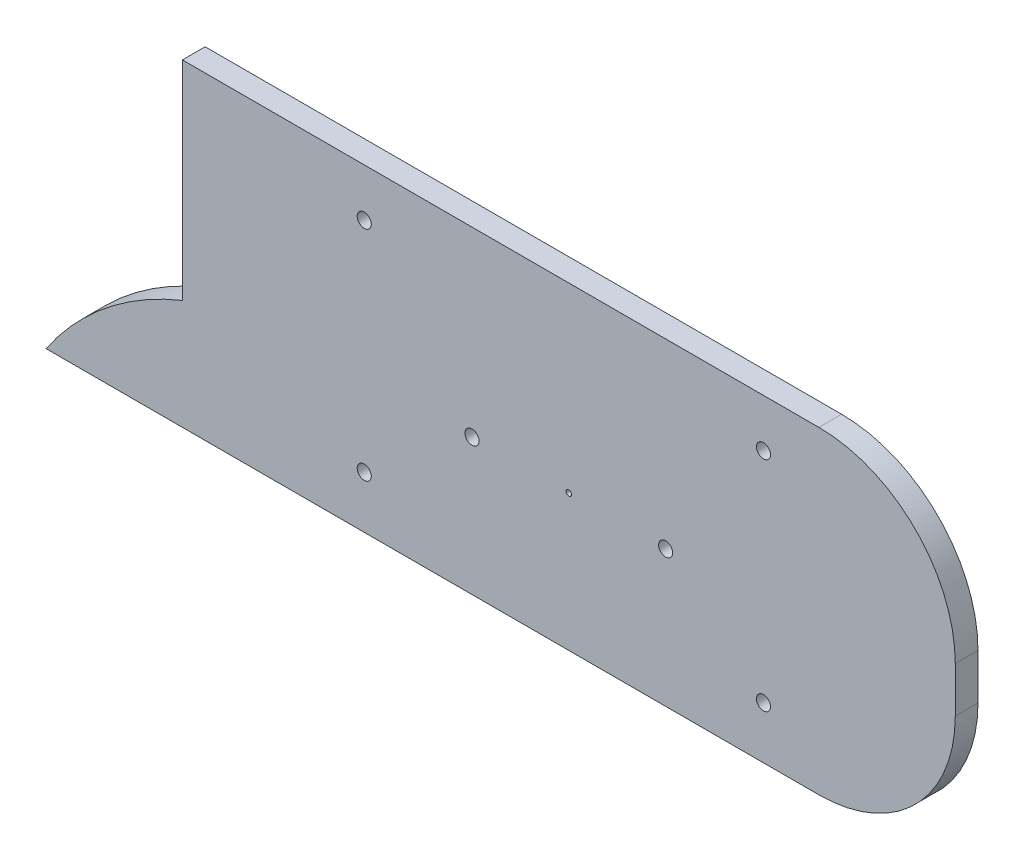
ISO-10303-21;
HEADER;
FILE_DESCRIPTION(('STEP AP214'),'2;1');
FILE_NAME('part.step','',(''),(''),'','','');
FILE_SCHEMA(('AUTOMOTIVE_DESIGN { 1 0 10303 214 1 1 1 1 }'));
ENDSEC;
DATA;
#1=APPLICATION_CONTEXT('core data for automotive mechanical design processes');
#2=APPLICATION_PROTOCOL_DEFINITION('international standard','automotive_design',2000,#1);
#3=PRODUCT_CONTEXT('',#1,'mechanical');
#4=PRODUCT('Part','Part','',(#3));
#5=PRODUCT_RELATED_PRODUCT_CATEGORY('part','',(#4));
#6=PRODUCT_DEFINITION_FORMATION('','',#4);
#7=PRODUCT_DEFINITION_CONTEXT('part definition',#1,'design');
#8=PRODUCT_DEFINITION('design','',#6,#7);
#9=PRODUCT_DEFINITION_SHAPE('','',#8);
#10=(LENGTH_UNIT() NAMED_UNIT(*) SI_UNIT(.MILLI.,.METRE.));
#11=(NAMED_UNIT(*) PLANE_ANGLE_UNIT() SI_UNIT($,.RADIAN.));
#12=(NAMED_UNIT(*) SI_UNIT($,.STERADIAN.) SOLID_ANGLE_UNIT());
#13=UNCERTAINTY_MEASURE_WITH_UNIT(LENGTH_MEASURE(1.E-05),#10,'distance_accuracy_value','');
#14=(GEOMETRIC_REPRESENTATION_CONTEXT(3) GLOBAL_UNCERTAINTY_ASSIGNED_CONTEXT((#13)) GLOBAL_UNIT_ASSIGNED_CONTEXT((#10,
#11,#12)) REPRESENTATION_CONTEXT('',''));
#15=CARTESIAN_POINT('',(0.,0.,0.));
#16=DIRECTION('',(0.,0.,1.));
#17=DIRECTION('',(1.,0.,0.));
#18=AXIS2_PLACEMENT_3D('',#15,#16,#17);
#19=CARTESIAN_POINT('',(138.386915245051,-93.7571467165055,12.7));
#20=DIRECTION('',(0.,0.,-1.));
#21=DIRECTION('',(-1.,0.,0.));
#22=AXIS2_PLACEMENT_3D('',#19,#20,#21);
#23=CYLINDRICAL_SURFACE('',#22,167.156635738642);
#24=CARTESIAN_POINT('',(138.386915245051,-93.7571467165055,0.));
#25=DIRECTION('',(0.,0.,1.));
#26=DIRECTION('',(-1.,0.,0.));
#27=AXIS2_PLACEMENT_3D('',#24,#25,#26);
#28=CIRCLE('',#27,167.156635738642);
#29=CARTESIAN_POINT('',(76.2,61.4012511991924,0.));
#30=VERTEX_POINT('',#29);
#31=CARTESIAN_POINT('',(0.,0.,0.));
#32=VERTEX_POINT('',#31);
#33=EDGE_CURVE('E143',#30,#32,#28,.T.);
#34=ORIENTED_EDGE('',*,*,#33,.T.);
#35=DIRECTION('',(0.,0.,-1.));
#36=VECTOR('',#35,1.);
#37=CARTESIAN_POINT('',(0.,0.,12.7));
#38=LINE('',#37,#36);
#39=CARTESIAN_POINT('',(0.,0.,12.7));
#40=VERTEX_POINT('',#39);
#41=EDGE_CURVE('E11',#40,#32,#38,.T.);
#42=ORIENTED_EDGE('',*,*,#41,.F.);
#43=CARTESIAN_POINT('',(138.386915245051,-93.7571467165055,12.7));
#44=DIRECTION('',(0.,0.,1.));
#45=DIRECTION('',(-1.,0.,0.));
#46=AXIS2_PLACEMENT_3D('',#43,#44,#45);
#47=CIRCLE('',#46,167.156635738642);
#48=CARTESIAN_POINT('',(76.2,61.4012511991924,12.7));
#49=VERTEX_POINT('',#48);
#50=EDGE_CURVE('E163',#49,#40,#47,.T.);
#51=ORIENTED_EDGE('',*,*,#50,.F.);
#52=DIRECTION('',(0.,0.,-1.));
#53=VECTOR('',#52,1.);
#54=CARTESIAN_POINT('',(76.2,61.4012511991924,12.7));
#55=LINE('',#54,#53);
#56=EDGE_CURVE('E139',#49,#30,#55,.T.);
#57=ORIENTED_EDGE('',*,*,#56,.T.);
#58=EDGE_LOOP('',(#34,#42,#51,#57));
#59=FACE_BOUND('',#58,.T.);
#60=ADVANCED_FACE('F47',(#59),#23,.T.);
#61=CARTESIAN_POINT('',(0.,0.,12.7));
#62=DIRECTION('',(0.,1.,0.));
#63=DIRECTION('',(-1.,0.,0.));
#64=AXIS2_PLACEMENT_3D('',#61,#62,#63);
#65=PLANE('',#64);
#66=DIRECTION('',(1.,0.,0.));
#67=VECTOR('',#66,1.);
#68=CARTESIAN_POINT('',(0.,0.,0.));
#69=LINE('',#68,#67);
#70=CARTESIAN_POINT('',(431.8,0.,0.));
#71=VERTEX_POINT('',#70);
#72=EDGE_CURVE('E147',#32,#71,#69,.T.);
#73=ORIENTED_EDGE('',*,*,#72,.T.);
#74=DIRECTION('',(0.,0.,-1.));
#75=VECTOR('',#74,1.);
#76=CARTESIAN_POINT('',(431.8,0.,12.7));
#77=LINE('',#76,#75);
#78=CARTESIAN_POINT('',(431.8,0.,12.7));
#79=VERTEX_POINT('',#78);
#80=EDGE_CURVE('E56',#79,#71,#77,.T.);
#81=ORIENTED_EDGE('',*,*,#80,.F.);
#82=DIRECTION('',(1.,0.,0.));
#83=VECTOR('',#82,1.);
#84=CARTESIAN_POINT('',(0.,0.,12.7));
#85=LINE('',#84,#83);
#86=EDGE_CURVE('E103',#40,#79,#85,.T.);
#87=ORIENTED_EDGE('',*,*,#86,.F.);
#88=ORIENTED_EDGE('',*,*,#41,.T.);
#89=EDGE_LOOP('',(#73,#81,#87,#88));
#90=FACE_BOUND('',#89,.T.);
#91=ADVANCED_FACE('F287',(#90),#65,.F.);
#92=CARTESIAN_POINT('',(431.8,76.2,12.7));
#93=DIRECTION('',(0.,0.,-1.));
#94=DIRECTION('',(-1.,0.,0.));
#95=AXIS2_PLACEMENT_3D('',#92,#93,#94);
#96=CYLINDRICAL_SURFACE('',#95,76.2);
#97=CARTESIAN_POINT('',(431.8,76.2,0.));
#98=DIRECTION('',(0.,0.,1.));
#99=DIRECTION('',(1.,0.,0.));
#100=AXIS2_PLACEMENT_3D('',#97,#98,#99);
#101=CIRCLE('',#100,76.2);
#102=CARTESIAN_POINT('',(508.,76.2,0.));
#103=VERTEX_POINT('',#102);
#104=EDGE_CURVE('E151',#71,#103,#101,.T.);
#105=ORIENTED_EDGE('',*,*,#104,.T.);
#106=DIRECTION('',(0.,0.,-1.));
#107=VECTOR('',#106,1.);
#108=CARTESIAN_POINT('',(508.,76.2,12.7));
#109=LINE('',#108,#107);
#110=CARTESIAN_POINT('',(508.,76.2,12.7));
#111=VERTEX_POINT('',#110);
#112=EDGE_CURVE('E170',#111,#103,#109,.T.);
#113=ORIENTED_EDGE('',*,*,#112,.F.);
#114=CARTESIAN_POINT('',(431.8,76.2,12.7));
#115=DIRECTION('',(0.,0.,1.));
#116=DIRECTION('',(1.,0.,0.));
#117=AXIS2_PLACEMENT_3D('',#114,#115,#116);
#118=CIRCLE('',#117,76.2);
#119=EDGE_CURVE('E181',#79,#111,#118,.T.);
#120=ORIENTED_EDGE('',*,*,#119,.F.);
#121=ORIENTED_EDGE('',*,*,#80,.T.);
#122=EDGE_LOOP('',(#105,#113,#120,#121));
#123=FACE_BOUND('',#122,.T.);
#124=ADVANCED_FACE('F179',(#123),#96,.T.);
#125=CARTESIAN_POINT('',(508.,76.2,12.7));
#126=DIRECTION('',(-1.,0.,0.));
#127=DIRECTION('',(0.,0.,1.));
#128=AXIS2_PLACEMENT_3D('',#125,#126,#127);
#129=PLANE('',#128);
#130=DIRECTION('',(0.,1.,0.));
#131=VECTOR('',#130,1.);
#132=CARTESIAN_POINT('',(508.,76.2,0.));
#133=LINE('',#132,#131);
#134=CARTESIAN_POINT('',(508.,101.6,0.));
#135=VERTEX_POINT('',#134);
#136=EDGE_CURVE('E154',#103,#135,#133,.T.);
#137=ORIENTED_EDGE('',*,*,#136,.T.);
#138=DIRECTION('',(0.,0.,-1.));
#139=VECTOR('',#138,1.);
#140=CARTESIAN_POINT('',(508.,101.6,12.7));
#141=LINE('',#140,#139);
#142=CARTESIAN_POINT('',(508.,101.6,12.7));
#143=VERTEX_POINT('',#142);
#144=EDGE_CURVE('E131',#143,#135,#141,.T.);
#145=ORIENTED_EDGE('',*,*,#144,.F.);
#146=DIRECTION('',(0.,1.,0.));
#147=VECTOR('',#146,1.);
#148=CARTESIAN_POINT('',(508.,76.2,12.7));
#149=LINE('',#148,#147);
#150=EDGE_CURVE('E119',#111,#143,#149,.T.);
#151=ORIENTED_EDGE('',*,*,#150,.F.);
#152=ORIENTED_EDGE('',*,*,#112,.T.);
#153=EDGE_LOOP('',(#137,#145,#151,#152));
#154=FACE_BOUND('',#153,.T.);
#155=ADVANCED_FACE('F187',(#154),#129,.F.);
#156=CARTESIAN_POINT('',(431.8,101.6,12.7));
#157=DIRECTION('',(0.,0.,-1.));
#158=DIRECTION('',(-1.,0.,0.));
#159=AXIS2_PLACEMENT_3D('',#156,#157,#158);
#160=CYLINDRICAL_SURFACE('',#159,76.2);
#161=CARTESIAN_POINT('',(431.8,101.6,0.));
#162=DIRECTION('',(0.,0.,1.));
#163=DIRECTION('',(1.,0.,0.));
#164=AXIS2_PLACEMENT_3D('',#161,#162,#163);
#165=CIRCLE('',#164,76.2);
#166=CARTESIAN_POINT('',(431.8,177.8,0.));
#167=VERTEX_POINT('',#166);
#168=EDGE_CURVE('E129',#135,#167,#165,.T.);
#169=ORIENTED_EDGE('',*,*,#168,.T.);
#170=DIRECTION('',(0.,0.,-1.));
#171=VECTOR('',#170,1.);
#172=CARTESIAN_POINT('',(431.8,177.8,12.7));
#173=LINE('',#172,#171);
#174=CARTESIAN_POINT('',(431.8,177.8,12.7));
#175=VERTEX_POINT('',#174);
#176=EDGE_CURVE('E126',#175,#167,#173,.T.);
#177=ORIENTED_EDGE('',*,*,#176,.F.);
#178=CARTESIAN_POINT('',(431.8,101.6,12.7));
#179=DIRECTION('',(0.,0.,1.));
#180=DIRECTION('',(1.,0.,0.));
#181=AXIS2_PLACEMENT_3D('',#178,#179,#180);
#182=CIRCLE('',#181,76.2);
#183=EDGE_CURVE('E113',#143,#175,#182,.T.);
#184=ORIENTED_EDGE('',*,*,#183,.F.);
#185=ORIENTED_EDGE('',*,*,#144,.T.);
#186=EDGE_LOOP('',(#169,#177,#184,#185));
#187=FACE_BOUND('',#186,.T.);
#188=ADVANCED_FACE('F127',(#187),#160,.T.);
#189=CARTESIAN_POINT('',(152.4,177.8,12.7));
#190=DIRECTION('',(0.,-1.,0.));
#191=DIRECTION('',(0.,0.,-1.));
#192=AXIS2_PLACEMENT_3D('',#189,#190,#191);
#193=PLANE('',#192);
#194=DIRECTION('',(-1.,0.,0.));
#195=VECTOR('',#194,1.);
#196=CARTESIAN_POINT('',(152.4,177.8,0.));
#197=LINE('',#196,#195);
#198=CARTESIAN_POINT('',(76.2,177.8,0.));
#199=VERTEX_POINT('',#198);
#200=EDGE_CURVE('E89',#167,#199,#197,.T.);
#201=ORIENTED_EDGE('',*,*,#200,.T.);
#202=DIRECTION('',(0.,0.,-1.));
#203=VECTOR('',#202,1.);
#204=CARTESIAN_POINT('',(76.2,177.8,12.7));
#205=LINE('',#204,#203);
#206=CARTESIAN_POINT('',(76.2,177.8,12.7));
#207=VERTEX_POINT('',#206);
#208=EDGE_CURVE('E132',#207,#199,#205,.T.);
#209=ORIENTED_EDGE('',*,*,#208,.F.);
#210=DIRECTION('',(-1.,0.,0.));
#211=VECTOR('',#210,1.);
#212=CARTESIAN_POINT('',(431.8,177.8,12.7));
#213=LINE('',#212,#211);
#214=EDGE_CURVE('E117',#175,#207,#213,.T.);
#215=ORIENTED_EDGE('',*,*,#214,.F.);
#216=ORIENTED_EDGE('',*,*,#176,.T.);
#217=EDGE_LOOP('',(#201,#209,#215,#216));
#218=FACE_BOUND('',#217,.T.);
#219=ADVANCED_FACE('F134',(#218),#193,.F.);
#220=CARTESIAN_POINT('',(76.2,177.8,12.7));
#221=DIRECTION('',(1.,0.,0.));
#222=DIRECTION('',(0.,0.,-1.));
#223=AXIS2_PLACEMENT_3D('',#220,#221,#222);
#224=PLANE('',#223);
#225=DIRECTION('',(0.,-1.,0.));
#226=VECTOR('',#225,1.);
#227=CARTESIAN_POINT('',(76.2,177.8,0.));
#228=LINE('',#227,#226);
#229=EDGE_CURVE('E95',#199,#30,#228,.T.);
#230=ORIENTED_EDGE('',*,*,#229,.T.);
#231=ORIENTED_EDGE('',*,*,#56,.F.);
#232=DIRECTION('',(0.,-1.,0.));
#233=VECTOR('',#232,1.);
#234=CARTESIAN_POINT('',(76.2,177.8,12.7));
#235=LINE('',#234,#233);
#236=EDGE_CURVE('E64',#207,#49,#235,.T.);
#237=ORIENTED_EDGE('',*,*,#236,.F.);
#238=ORIENTED_EDGE('',*,*,#208,.T.);
#239=EDGE_LOOP('',(#230,#231,#237,#238));
#240=FACE_BOUND('',#239,.T.);
#241=ADVANCED_FACE('F258',(#240),#224,.F.);
#242=CARTESIAN_POINT('',(138.386915245051,-93.7571467165055,12.7));
#243=DIRECTION('',(0.,0.,-1.));
#244=DIRECTION('',(-1.,0.,0.));
#245=AXIS2_PLACEMENT_3D('',#242,#243,#244);
#246=PLANE('',#245);
#247=CARTESIAN_POINT('',(346.202,76.2,12.7));
#248=DIRECTION('',(0.,0.,1.));
#249=DIRECTION('',(1.,0.,0.));
#250=AXIS2_PLACEMENT_3D('',#247,#248,#249);
#251=CIRCLE('',#250,3.937);
#252=CARTESIAN_POINT('',(350.139,76.2,12.7));
#253=VERTEX_POINT('',#252);
#254=EDGE_CURVE('E241',#253,#253,#251,.T.);
#255=ORIENTED_EDGE('',*,*,#254,.F.);
#256=EDGE_LOOP('',(#255));
#257=FACE_BOUND('',#256,.T.);
#258=CARTESIAN_POINT('',(237.998,76.2,12.7));
#259=DIRECTION('',(0.,0.,1.));
#260=DIRECTION('',(1.,0.,0.));
#261=AXIS2_PLACEMENT_3D('',#258,#259,#260);
#262=CIRCLE('',#261,3.937);
#263=CARTESIAN_POINT('',(241.935,76.2,12.7));
#264=VERTEX_POINT('',#263);
#265=EDGE_CURVE('E233',#264,#264,#262,.T.);
#266=ORIENTED_EDGE('',*,*,#265,.F.);
#267=EDGE_LOOP('',(#266));
#268=FACE_BOUND('',#267,.T.);
#269=CARTESIAN_POINT('',(292.1,76.2,12.7));
#270=DIRECTION('',(0.,0.,1.));
#271=DIRECTION('',(1.,0.,0.));
#272=AXIS2_PLACEMENT_3D('',#269,#270,#271);
#273=CIRCLE('',#272,1.52400000000001);
#274=CARTESIAN_POINT('',(293.624,76.2,12.7));
#275=VERTEX_POINT('',#274);
#276=EDGE_CURVE('E229',#275,#275,#273,.T.);
#277=ORIENTED_EDGE('',*,*,#276,.F.);
#278=EDGE_LOOP('',(#277));
#279=FACE_BOUND('',#278,.T.);
#280=CARTESIAN_POINT('',(177.8,151.002055279283,12.7));
#281=DIRECTION('',(0.,0.,-1.));
#282=DIRECTION('',(-1.,0.,0.));
#283=AXIS2_PLACEMENT_3D('',#280,#281,#282);
#284=CIRCLE('',#283,3.937);
#285=CARTESIAN_POINT('',(173.863,151.002055279283,12.7));
#286=VERTEX_POINT('',#285);
#287=EDGE_CURVE('E205',#286,#286,#284,.T.);
#288=ORIENTED_EDGE('',*,*,#287,.T.);
#289=EDGE_LOOP('',(#288));
#290=FACE_BOUND('',#289,.T.);
#291=CARTESIAN_POINT('',(400.836394981922,151.002055279283,12.7));
#292=DIRECTION('',(0.,0.,-1.));
#293=DIRECTION('',(-1.,0.,0.));
#294=AXIS2_PLACEMENT_3D('',#291,#292,#293);
#295=CIRCLE('',#294,3.937);
#296=CARTESIAN_POINT('',(396.899394981922,151.002055279283,12.7));
#297=VERTEX_POINT('',#296);
#298=EDGE_CURVE('E214',#297,#297,#295,.T.);
#299=ORIENTED_EDGE('',*,*,#298,.T.);
#300=EDGE_LOOP('',(#299));
#301=FACE_BOUND('',#300,.T.);
#302=CARTESIAN_POINT('',(400.836394981922,29.0820552792826,12.7));
#303=DIRECTION('',(0.,0.,-1.));
#304=DIRECTION('',(-1.,0.,0.));
#305=AXIS2_PLACEMENT_3D('',#302,#303,#304);
#306=CIRCLE('',#305,3.937);
#307=CARTESIAN_POINT('',(396.899394981922,29.0820552792826,12.7));
#308=VERTEX_POINT('',#307);
#309=EDGE_CURVE('E222',#308,#308,#306,.T.);
#310=ORIENTED_EDGE('',*,*,#309,.T.);
#311=EDGE_LOOP('',(#310));
#312=FACE_BOUND('',#311,.T.);
#313=CARTESIAN_POINT('',(177.8,29.0820552792826,12.7));
#314=DIRECTION('',(0.,0.,-1.));
#315=DIRECTION('',(-1.,0.,0.));
#316=AXIS2_PLACEMENT_3D('',#313,#314,#315);
#317=CIRCLE('',#316,3.937);
#318=CARTESIAN_POINT('',(173.863,29.0820552792826,12.7));
#319=VERTEX_POINT('',#318);
#320=EDGE_CURVE('E148',#319,#319,#317,.T.);
#321=ORIENTED_EDGE('',*,*,#320,.T.);
#322=EDGE_LOOP('',(#321));
#323=FACE_BOUND('',#322,.T.);
#324=ORIENTED_EDGE('',*,*,#50,.T.);
#325=ORIENTED_EDGE('',*,*,#86,.T.);
#326=ORIENTED_EDGE('',*,*,#119,.T.);
#327=ORIENTED_EDGE('',*,*,#150,.T.);
#328=ORIENTED_EDGE('',*,*,#183,.T.);
#329=ORIENTED_EDGE('',*,*,#214,.T.);
#330=ORIENTED_EDGE('',*,*,#236,.T.);
#331=EDGE_LOOP('',(#324,#325,#326,#327,#328,#329,#330));
#332=FACE_BOUND('',#331,.T.);
#333=ADVANCED_FACE('F115',(#257,#268,#279,#290,#301,#312,#323,#332),#246,.F.);
#334=CARTESIAN_POINT('',(138.386915245051,-93.7571467165055,0.));
#335=DIRECTION('',(0.,0.,-1.));
#336=DIRECTION('',(-1.,0.,0.));
#337=AXIS2_PLACEMENT_3D('',#334,#335,#336);
#338=PLANE('',#337);
#339=CARTESIAN_POINT('',(346.202,76.2,0.));
#340=DIRECTION('',(0.,0.,1.));
#341=DIRECTION('',(1.,0.,0.));
#342=AXIS2_PLACEMENT_3D('',#339,#340,#341);
#343=CIRCLE('',#342,3.937);
#344=CARTESIAN_POINT('',(350.139,76.2,0.));
#345=VERTEX_POINT('',#344);
#346=EDGE_CURVE('E237',#345,#345,#343,.T.);
#347=ORIENTED_EDGE('',*,*,#346,.T.);
#348=EDGE_LOOP('',(#347));
#349=FACE_BOUND('',#348,.T.);
#350=CARTESIAN_POINT('',(237.998,76.2,0.));
#351=DIRECTION('',(0.,0.,1.));
#352=DIRECTION('',(1.,0.,0.));
#353=AXIS2_PLACEMENT_3D('',#350,#351,#352);
#354=CIRCLE('',#353,3.937);
#355=CARTESIAN_POINT('',(241.935,76.2,0.));
#356=VERTEX_POINT('',#355);
#357=EDGE_CURVE('E245',#356,#356,#354,.T.);
#358=ORIENTED_EDGE('',*,*,#357,.T.);
#359=EDGE_LOOP('',(#358));
#360=FACE_BOUND('',#359,.T.);
#361=CARTESIAN_POINT('',(292.1,76.2,0.));
#362=DIRECTION('',(0.,0.,1.));
#363=DIRECTION('',(1.,0.,0.));
#364=AXIS2_PLACEMENT_3D('',#361,#362,#363);
#365=CIRCLE('',#364,1.52400000000001);
#366=CARTESIAN_POINT('',(293.624,76.2,0.));
#367=VERTEX_POINT('',#366);
#368=EDGE_CURVE('E210',#367,#367,#365,.T.);
#369=ORIENTED_EDGE('',*,*,#368,.T.);
#370=EDGE_LOOP('',(#369));
#371=FACE_BOUND('',#370,.T.);
#372=CARTESIAN_POINT('',(177.8,151.002055279283,0.));
#373=DIRECTION('',(0.,0.,-1.));
#374=DIRECTION('',(-1.,0.,0.));
#375=AXIS2_PLACEMENT_3D('',#372,#373,#374);
#376=CIRCLE('',#375,3.937);
#377=CARTESIAN_POINT('',(173.863,151.002055279283,0.));
#378=VERTEX_POINT('',#377);
#379=EDGE_CURVE('E209',#378,#378,#376,.T.);
#380=ORIENTED_EDGE('',*,*,#379,.F.);
#381=EDGE_LOOP('',(#380));
#382=FACE_BOUND('',#381,.T.);
#383=CARTESIAN_POINT('',(400.836394981922,151.002055279283,0.));
#384=DIRECTION('',(0.,0.,-1.));
#385=DIRECTION('',(-1.,0.,0.));
#386=AXIS2_PLACEMENT_3D('',#383,#384,#385);
#387=CIRCLE('',#386,3.937);
#388=CARTESIAN_POINT('',(396.899394981922,151.002055279283,0.));
#389=VERTEX_POINT('',#388);
#390=EDGE_CURVE('E218',#389,#389,#387,.T.);
#391=ORIENTED_EDGE('',*,*,#390,.F.);
#392=EDGE_LOOP('',(#391));
#393=FACE_BOUND('',#392,.T.);
#394=CARTESIAN_POINT('',(400.836394981922,29.0820552792826,0.));
#395=DIRECTION('',(0.,0.,-1.));
#396=DIRECTION('',(-1.,0.,0.));
#397=AXIS2_PLACEMENT_3D('',#394,#395,#396);
#398=CIRCLE('',#397,3.937);
#399=CARTESIAN_POINT('',(396.899394981922,29.0820552792826,0.));
#400=VERTEX_POINT('',#399);
#401=EDGE_CURVE('E201',#400,#400,#398,.T.);
#402=ORIENTED_EDGE('',*,*,#401,.F.);
#403=EDGE_LOOP('',(#402));
#404=FACE_BOUND('',#403,.T.);
#405=CARTESIAN_POINT('',(177.8,29.0820552792826,0.));
#406=DIRECTION('',(0.,0.,-1.));
#407=DIRECTION('',(-1.,0.,0.));
#408=AXIS2_PLACEMENT_3D('',#405,#406,#407);
#409=CIRCLE('',#408,3.937);
#410=CARTESIAN_POINT('',(173.863,29.0820552792826,0.));
#411=VERTEX_POINT('',#410);
#412=EDGE_CURVE('E197',#411,#411,#409,.T.);
#413=ORIENTED_EDGE('',*,*,#412,.F.);
#414=EDGE_LOOP('',(#413));
#415=FACE_BOUND('',#414,.T.);
#416=ORIENTED_EDGE('',*,*,#33,.F.);
#417=ORIENTED_EDGE('',*,*,#229,.F.);
#418=ORIENTED_EDGE('',*,*,#200,.F.);
#419=ORIENTED_EDGE('',*,*,#168,.F.);
#420=ORIENTED_EDGE('',*,*,#136,.F.);
#421=ORIENTED_EDGE('',*,*,#104,.F.);
#422=ORIENTED_EDGE('',*,*,#72,.F.);
#423=EDGE_LOOP('',(#416,#417,#418,#419,#420,#421,#422));
#424=FACE_BOUND('',#423,.T.);
#425=ADVANCED_FACE('F185',(#349,#360,#371,#382,#393,#404,#415,#424),#338,.T.);
#426=CARTESIAN_POINT('',(177.8,29.0820552792826,12.7));
#427=DIRECTION('',(0.,0.,-1.));
#428=DIRECTION('',(-1.,0.,0.));
#429=AXIS2_PLACEMENT_3D('',#426,#427,#428);
#430=CYLINDRICAL_SURFACE('',#429,3.937);
#431=ORIENTED_EDGE('',*,*,#320,.F.);
#432=EDGE_LOOP('',(#431));
#433=FACE_BOUND('',#432,.T.);
#434=ORIENTED_EDGE('',*,*,#412,.T.);
#435=EDGE_LOOP('',(#434));
#436=FACE_BOUND('',#435,.T.);
#437=ADVANCED_FACE('F271',(#433,#436),#430,.F.);
#438=CARTESIAN_POINT('',(400.836394981922,29.0820552792826,12.7));
#439=DIRECTION('',(0.,0.,-1.));
#440=DIRECTION('',(-1.,0.,0.));
#441=AXIS2_PLACEMENT_3D('',#438,#439,#440);
#442=CYLINDRICAL_SURFACE('',#441,3.937);
#443=ORIENTED_EDGE('',*,*,#309,.F.);
#444=EDGE_LOOP('',(#443));
#445=FACE_BOUND('',#444,.T.);
#446=ORIENTED_EDGE('',*,*,#401,.T.);
#447=EDGE_LOOP('',(#446));
#448=FACE_BOUND('',#447,.T.);
#449=ADVANCED_FACE('F274',(#445,#448),#442,.F.);
#450=CARTESIAN_POINT('',(400.836394981922,151.002055279283,12.7));
#451=DIRECTION('',(0.,0.,-1.));
#452=DIRECTION('',(-1.,0.,0.));
#453=AXIS2_PLACEMENT_3D('',#450,#451,#452);
#454=CYLINDRICAL_SURFACE('',#453,3.937);
#455=ORIENTED_EDGE('',*,*,#298,.F.);
#456=EDGE_LOOP('',(#455));
#457=FACE_BOUND('',#456,.T.);
#458=ORIENTED_EDGE('',*,*,#390,.T.);
#459=EDGE_LOOP('',(#458));
#460=FACE_BOUND('',#459,.T.);
#461=ADVANCED_FACE('F357',(#457,#460),#454,.F.);
#462=CARTESIAN_POINT('',(177.8,151.002055279283,12.7));
#463=DIRECTION('',(0.,0.,-1.));
#464=DIRECTION('',(-1.,0.,0.));
#465=AXIS2_PLACEMENT_3D('',#462,#463,#464);
#466=CYLINDRICAL_SURFACE('',#465,3.937);
#467=ORIENTED_EDGE('',*,*,#287,.F.);
#468=EDGE_LOOP('',(#467));
#469=FACE_BOUND('',#468,.T.);
#470=ORIENTED_EDGE('',*,*,#379,.T.);
#471=EDGE_LOOP('',(#470));
#472=FACE_BOUND('',#471,.T.);
#473=ADVANCED_FACE('F367',(#469,#472),#466,.F.);
#474=CARTESIAN_POINT('',(292.1,76.2,0.));
#475=DIRECTION('',(0.,0.,1.));
#476=DIRECTION('',(1.,0.,0.));
#477=AXIS2_PLACEMENT_3D('',#474,#475,#476);
#478=CYLINDRICAL_SURFACE('',#477,1.52400000000001);
#479=ORIENTED_EDGE('',*,*,#368,.F.);
#480=EDGE_LOOP('',(#479));
#481=FACE_BOUND('',#480,.T.);
#482=ORIENTED_EDGE('',*,*,#276,.T.);
#483=EDGE_LOOP('',(#482));
#484=FACE_BOUND('',#483,.T.);
#485=ADVANCED_FACE('F376',(#481,#484),#478,.F.);
#486=CARTESIAN_POINT('',(237.998,76.2,0.));
#487=DIRECTION('',(0.,0.,1.));
#488=DIRECTION('',(1.,0.,0.));
#489=AXIS2_PLACEMENT_3D('',#486,#487,#488);
#490=CYLINDRICAL_SURFACE('',#489,3.937);
#491=ORIENTED_EDGE('',*,*,#357,.F.);
#492=EDGE_LOOP('',(#491));
#493=FACE_BOUND('',#492,.T.);
#494=ORIENTED_EDGE('',*,*,#265,.T.);
#495=EDGE_LOOP('',(#494));
#496=FACE_BOUND('',#495,.T.);
#497=ADVANCED_FACE('F254',(#493,#496),#490,.F.);
#498=CARTESIAN_POINT('',(346.202,76.2,0.));
#499=DIRECTION('',(0.,0.,1.));
#500=DIRECTION('',(1.,0.,0.));
#501=AXIS2_PLACEMENT_3D('',#498,#499,#500);
#502=CYLINDRICAL_SURFACE('',#501,3.937);
#503=ORIENTED_EDGE('',*,*,#346,.F.);
#504=EDGE_LOOP('',(#503));
#505=FACE_BOUND('',#504,.T.);
#506=ORIENTED_EDGE('',*,*,#254,.T.);
#507=EDGE_LOOP('',(#506));
#508=FACE_BOUND('',#507,.T.);
#509=ADVANCED_FACE('F394',(#505,#508),#502,.F.);
#510=CLOSED_SHELL('',(#60,#91,#124,#155,#188,#219,#241,#333,#425,#437,#449,#461,#473,#485,#497,#509));
#511=MANIFOLD_SOLID_BREP('B2',#510);
#512=ADVANCED_BREP_SHAPE_REPRESENTATION('',(#18,#511),#14);
#513=SHAPE_DEFINITION_REPRESENTATION(#9,#512);
ENDSEC;
END-ISO-10303-21;
